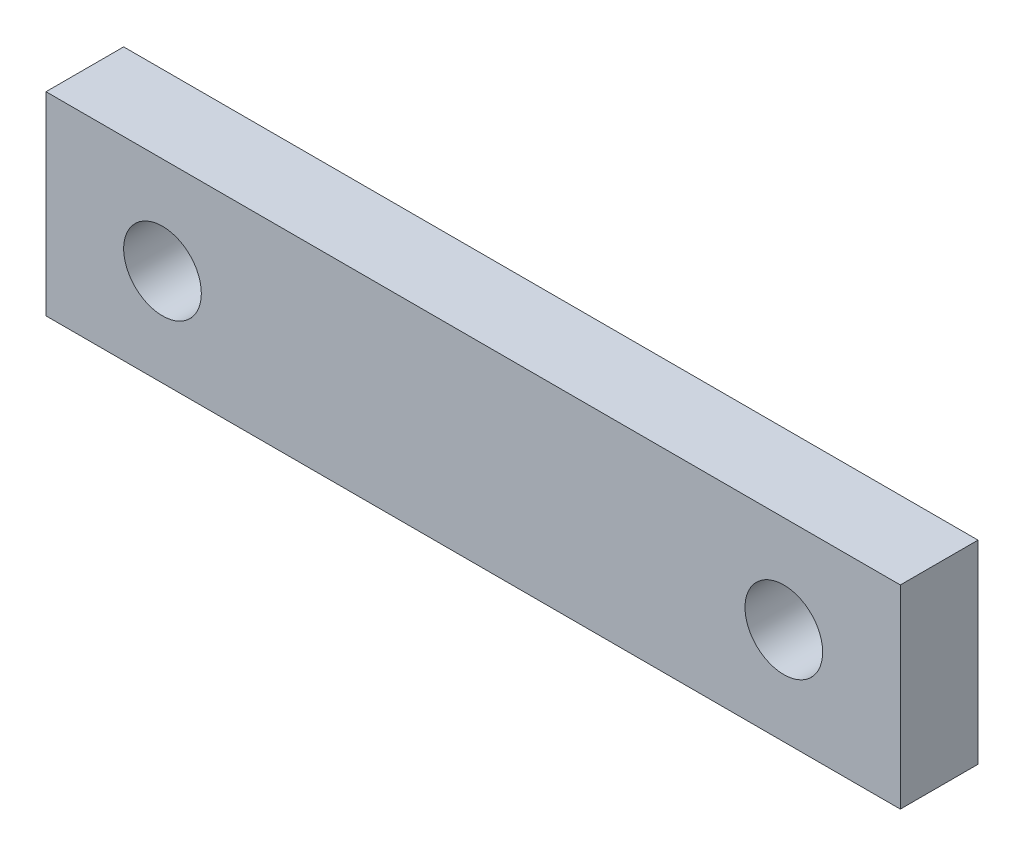
ISO-10303-21;
HEADER;
FILE_DESCRIPTION(('STEP AP214'),'2;1');
FILE_NAME('part.step','',(''),(''),'','','');
FILE_SCHEMA(('AUTOMOTIVE_DESIGN { 1 0 10303 214 1 1 1 1 }'));
ENDSEC;
DATA;
#1=APPLICATION_CONTEXT('core data for automotive mechanical design processes');
#2=APPLICATION_PROTOCOL_DEFINITION('international standard','automotive_design',2000,#1);
#3=PRODUCT_CONTEXT('',#1,'mechanical');
#4=PRODUCT('Part','Part','',(#3));
#5=PRODUCT_RELATED_PRODUCT_CATEGORY('part','',(#4));
#6=PRODUCT_DEFINITION_FORMATION('','',#4);
#7=PRODUCT_DEFINITION_CONTEXT('part definition',#1,'design');
#8=PRODUCT_DEFINITION('design','',#6,#7);
#9=PRODUCT_DEFINITION_SHAPE('','',#8);
#10=(LENGTH_UNIT() NAMED_UNIT(*) SI_UNIT(.MILLI.,.METRE.));
#11=(NAMED_UNIT(*) PLANE_ANGLE_UNIT() SI_UNIT($,.RADIAN.));
#12=(NAMED_UNIT(*) SI_UNIT($,.STERADIAN.) SOLID_ANGLE_UNIT());
#13=UNCERTAINTY_MEASURE_WITH_UNIT(LENGTH_MEASURE(1.E-05),#10,'distance_accuracy_value','');
#14=(GEOMETRIC_REPRESENTATION_CONTEXT(3) GLOBAL_UNCERTAINTY_ASSIGNED_CONTEXT((#13)) GLOBAL_UNIT_ASSIGNED_CONTEXT((#10,
#11,#12)) REPRESENTATION_CONTEXT('',''));
#15=CARTESIAN_POINT('',(0.,0.,0.));
#16=DIRECTION('',(0.,0.,1.));
#17=DIRECTION('',(1.,0.,0.));
#18=AXIS2_PLACEMENT_3D('',#15,#16,#17);
#19=CARTESIAN_POINT('',(-62.9567965181082,47.7044346254966,25.4));
#20=DIRECTION('',(1.,0.,0.));
#21=DIRECTION('',(0.,1.,0.));
#22=AXIS2_PLACEMENT_3D('',#19,#20,#21);
#23=PLANE('',#22);
#24=DIRECTION('',(0.,-1.,0.));
#25=VECTOR('',#24,1.);
#26=CARTESIAN_POINT('',(-62.9567965181082,47.7044346254966,0.));
#27=LINE('',#26,#25);
#28=CARTESIAN_POINT('',(-62.9567965181082,47.7044346254966,0.));
#29=VERTEX_POINT('',#28);
#30=CARTESIAN_POINT('',(-62.9567965181081,-15.7955653745034,0.));
#31=VERTEX_POINT('',#30);
#32=EDGE_CURVE('E107',#29,#31,#27,.T.);
#33=ORIENTED_EDGE('',*,*,#32,.T.);
#34=DIRECTION('',(0.,0.,-1.));
#35=VECTOR('',#34,1.);
#36=CARTESIAN_POINT('',(-62.9567965181081,-15.7955653745034,25.4));
#37=LINE('',#36,#35);
#38=CARTESIAN_POINT('',(-62.9567965181081,-15.7955653745034,25.4));
#39=VERTEX_POINT('',#38);
#40=EDGE_CURVE('E11',#39,#31,#37,.T.);
#41=ORIENTED_EDGE('',*,*,#40,.F.);
#42=DIRECTION('',(0.,-1.,0.));
#43=VECTOR('',#42,1.);
#44=CARTESIAN_POINT('',(-62.9567965181082,47.7044346254966,25.4));
#45=LINE('',#44,#43);
#46=CARTESIAN_POINT('',(-62.9567965181082,47.7044346254966,25.4));
#47=VERTEX_POINT('',#46);
#48=EDGE_CURVE('E91',#47,#39,#45,.T.);
#49=ORIENTED_EDGE('',*,*,#48,.F.);
#50=DIRECTION('',(0.,0.,-1.));
#51=VECTOR('',#50,1.);
#52=CARTESIAN_POINT('',(-62.9567965181082,47.7044346254966,25.4));
#53=LINE('',#52,#51);
#54=EDGE_CURVE('E103',#47,#29,#53,.T.);
#55=ORIENTED_EDGE('',*,*,#54,.T.);
#56=EDGE_LOOP('',(#33,#41,#49,#55));
#57=FACE_BOUND('',#56,.T.);
#58=ADVANCED_FACE('F39',(#57),#23,.F.);
#59=CARTESIAN_POINT('',(-62.9567965181081,-15.7955653745034,25.4));
#60=DIRECTION('',(0.,1.,0.));
#61=DIRECTION('',(0.,0.,1.));
#62=AXIS2_PLACEMENT_3D('',#59,#60,#61);
#63=PLANE('',#62);
#64=DIRECTION('',(1.,0.,0.));
#65=VECTOR('',#64,1.);
#66=CARTESIAN_POINT('',(-62.9567965181081,-15.7955653745034,0.));
#67=LINE('',#66,#65);
#68=CARTESIAN_POINT('',(216.443203481892,-15.7955653745034,0.));
#69=VERTEX_POINT('',#68);
#70=EDGE_CURVE('E96',#31,#69,#67,.T.);
#71=ORIENTED_EDGE('',*,*,#70,.T.);
#72=DIRECTION('',(0.,0.,-1.));
#73=VECTOR('',#72,1.);
#74=CARTESIAN_POINT('',(216.443203481892,-15.7955653745034,25.4));
#75=LINE('',#74,#73);
#76=CARTESIAN_POINT('',(216.443203481892,-15.7955653745034,25.4));
#77=VERTEX_POINT('',#76);
#78=EDGE_CURVE('E48',#77,#69,#75,.T.);
#79=ORIENTED_EDGE('',*,*,#78,.F.);
#80=DIRECTION('',(1.,0.,0.));
#81=VECTOR('',#80,1.);
#82=CARTESIAN_POINT('',(-62.9567965181081,-15.7955653745034,25.4));
#83=LINE('',#82,#81);
#84=EDGE_CURVE('E86',#39,#77,#83,.T.);
#85=ORIENTED_EDGE('',*,*,#84,.F.);
#86=ORIENTED_EDGE('',*,*,#40,.T.);
#87=EDGE_LOOP('',(#71,#79,#85,#86));
#88=FACE_BOUND('',#87,.T.);
#89=ADVANCED_FACE('F95',(#88),#63,.F.);
#90=CARTESIAN_POINT('',(216.443203481892,47.7044346254966,25.4));
#91=DIRECTION('',(-1.,0.,0.));
#92=DIRECTION('',(0.,0.,1.));
#93=AXIS2_PLACEMENT_3D('',#90,#91,#92);
#94=PLANE('',#93);
#95=DIRECTION('',(0.,1.,0.));
#96=VECTOR('',#95,1.);
#97=CARTESIAN_POINT('',(216.443203481892,47.7044346254966,0.));
#98=LINE('',#97,#96);
#99=CARTESIAN_POINT('',(216.443203481892,47.7044346254966,0.));
#100=VERTEX_POINT('',#99);
#101=EDGE_CURVE('E73',#69,#100,#98,.T.);
#102=ORIENTED_EDGE('',*,*,#101,.T.);
#103=DIRECTION('',(0.,0.,-1.));
#104=VECTOR('',#103,1.);
#105=CARTESIAN_POINT('',(216.443203481892,47.7044346254966,25.4));
#106=LINE('',#105,#104);
#107=CARTESIAN_POINT('',(216.443203481892,47.7044346254966,25.4));
#108=VERTEX_POINT('',#107);
#109=EDGE_CURVE('E98',#108,#100,#106,.T.);
#110=ORIENTED_EDGE('',*,*,#109,.F.);
#111=DIRECTION('',(0.,1.,0.));
#112=VECTOR('',#111,1.);
#113=CARTESIAN_POINT('',(216.443203481892,47.7044346254966,25.4));
#114=LINE('',#113,#112);
#115=EDGE_CURVE('E89',#77,#108,#114,.T.);
#116=ORIENTED_EDGE('',*,*,#115,.F.);
#117=ORIENTED_EDGE('',*,*,#78,.T.);
#118=EDGE_LOOP('',(#102,#110,#116,#117));
#119=FACE_BOUND('',#118,.T.);
#120=ADVANCED_FACE('F99',(#119),#94,.F.);
#121=CARTESIAN_POINT('',(-62.9567965181082,47.7044346254966,25.4));
#122=DIRECTION('',(0.,-1.,0.));
#123=DIRECTION('',(0.,0.,-1.));
#124=AXIS2_PLACEMENT_3D('',#121,#122,#123);
#125=PLANE('',#124);
#126=DIRECTION('',(-1.,0.,0.));
#127=VECTOR('',#126,1.);
#128=CARTESIAN_POINT('',(-62.9567965181082,47.7044346254966,0.));
#129=LINE('',#128,#127);
#130=EDGE_CURVE('E79',#100,#29,#129,.T.);
#131=ORIENTED_EDGE('',*,*,#130,.T.);
#132=ORIENTED_EDGE('',*,*,#54,.F.);
#133=DIRECTION('',(-1.,0.,0.));
#134=VECTOR('',#133,1.);
#135=CARTESIAN_POINT('',(-62.9567965181082,47.7044346254966,25.4));
#136=LINE('',#135,#134);
#137=EDGE_CURVE('E56',#108,#47,#136,.T.);
#138=ORIENTED_EDGE('',*,*,#137,.F.);
#139=ORIENTED_EDGE('',*,*,#109,.T.);
#140=EDGE_LOOP('',(#131,#132,#138,#139));
#141=FACE_BOUND('',#140,.T.);
#142=ADVANCED_FACE('F121',(#141),#125,.F.);
#143=CARTESIAN_POINT('',(0.,0.,25.4));
#144=DIRECTION('',(0.,0.,1.));
#145=DIRECTION('',(1.,0.,0.));
#146=AXIS2_PLACEMENT_3D('',#143,#144,#145);
#147=PLANE('',#146);
#148=CARTESIAN_POINT('',(-24.8567965181082,15.9544346254966,25.4));
#149=DIRECTION('',(0.,0.,1.));
#150=DIRECTION('',(1.,0.,0.));
#151=AXIS2_PLACEMENT_3D('',#148,#149,#150);
#152=CIRCLE('',#151,12.7);
#153=CARTESIAN_POINT('',(-12.1567965181082,15.9544346254966,25.4));
#154=VERTEX_POINT('',#153);
#155=EDGE_CURVE('E136',#154,#154,#152,.T.);
#156=ORIENTED_EDGE('',*,*,#155,.F.);
#157=EDGE_LOOP('',(#156));
#158=FACE_BOUND('',#157,.T.);
#159=CARTESIAN_POINT('',(178.343203481892,15.9544346254966,25.4));
#160=DIRECTION('',(0.,0.,1.));
#161=DIRECTION('',(1.,0.,0.));
#162=AXIS2_PLACEMENT_3D('',#159,#160,#161);
#163=CIRCLE('',#162,12.7);
#164=CARTESIAN_POINT('',(191.043203481892,15.9544346254966,25.4));
#165=VERTEX_POINT('',#164);
#166=EDGE_CURVE('E128',#165,#165,#163,.T.);
#167=ORIENTED_EDGE('',*,*,#166,.F.);
#168=EDGE_LOOP('',(#167));
#169=FACE_BOUND('',#168,.T.);
#170=ORIENTED_EDGE('',*,*,#48,.T.);
#171=ORIENTED_EDGE('',*,*,#84,.T.);
#172=ORIENTED_EDGE('',*,*,#115,.T.);
#173=ORIENTED_EDGE('',*,*,#137,.T.);
#174=EDGE_LOOP('',(#170,#171,#172,#173));
#175=FACE_BOUND('',#174,.T.);
#176=ADVANCED_FACE('F87',(#158,#169,#175),#147,.T.);
#177=CARTESIAN_POINT('',(0.,0.,0.));
#178=DIRECTION('',(0.,0.,1.));
#179=DIRECTION('',(1.,0.,0.));
#180=AXIS2_PLACEMENT_3D('',#177,#178,#179);
#181=PLANE('',#180);
#182=CARTESIAN_POINT('',(-24.8567965181082,15.9544346254966,0.));
#183=DIRECTION('',(0.,0.,1.));
#184=DIRECTION('',(1.,0.,0.));
#185=AXIS2_PLACEMENT_3D('',#182,#183,#184);
#186=CIRCLE('',#185,12.7);
#187=CARTESIAN_POINT('',(-12.1567965181082,15.9544346254966,0.));
#188=VERTEX_POINT('',#187);
#189=EDGE_CURVE('E132',#188,#188,#186,.T.);
#190=ORIENTED_EDGE('',*,*,#189,.T.);
#191=EDGE_LOOP('',(#190));
#192=FACE_BOUND('',#191,.T.);
#193=CARTESIAN_POINT('',(178.343203481892,15.9544346254966,0.));
#194=DIRECTION('',(0.,0.,1.));
#195=DIRECTION('',(1.,0.,0.));
#196=AXIS2_PLACEMENT_3D('',#193,#194,#195);
#197=CIRCLE('',#196,12.7);
#198=CARTESIAN_POINT('',(191.043203481892,15.9544346254966,0.));
#199=VERTEX_POINT('',#198);
#200=EDGE_CURVE('E111',#199,#199,#197,.T.);
#201=ORIENTED_EDGE('',*,*,#200,.T.);
#202=EDGE_LOOP('',(#201));
#203=FACE_BOUND('',#202,.T.);
#204=ORIENTED_EDGE('',*,*,#32,.F.);
#205=ORIENTED_EDGE('',*,*,#130,.F.);
#206=ORIENTED_EDGE('',*,*,#101,.F.);
#207=ORIENTED_EDGE('',*,*,#70,.F.);
#208=EDGE_LOOP('',(#204,#205,#206,#207));
#209=FACE_BOUND('',#208,.T.);
#210=ADVANCED_FACE('F124',(#192,#203,#209),#181,.F.);
#211=CARTESIAN_POINT('',(178.343203481892,15.9544346254966,0.));
#212=DIRECTION('',(0.,0.,1.));
#213=DIRECTION('',(1.,0.,0.));
#214=AXIS2_PLACEMENT_3D('',#211,#212,#213);
#215=CYLINDRICAL_SURFACE('',#214,12.7);
#216=ORIENTED_EDGE('',*,*,#200,.F.);
#217=EDGE_LOOP('',(#216));
#218=FACE_BOUND('',#217,.T.);
#219=ORIENTED_EDGE('',*,*,#166,.T.);
#220=EDGE_LOOP('',(#219));
#221=FACE_BOUND('',#220,.T.);
#222=ADVANCED_FACE('F149',(#218,#221),#215,.F.);
#223=CARTESIAN_POINT('',(-24.8567965181082,15.9544346254966,0.));
#224=DIRECTION('',(0.,0.,1.));
#225=DIRECTION('',(1.,0.,0.));
#226=AXIS2_PLACEMENT_3D('',#223,#224,#225);
#227=CYLINDRICAL_SURFACE('',#226,12.7);
#228=ORIENTED_EDGE('',*,*,#189,.F.);
#229=EDGE_LOOP('',(#228));
#230=FACE_BOUND('',#229,.T.);
#231=ORIENTED_EDGE('',*,*,#155,.T.);
#232=EDGE_LOOP('',(#231));
#233=FACE_BOUND('',#232,.T.);
#234=ADVANCED_FACE('F146',(#230,#233),#227,.F.);
#235=CLOSED_SHELL('',(#58,#89,#120,#142,#176,#210,#222,#234));
#236=MANIFOLD_SOLID_BREP('B2',#235);
#237=ADVANCED_BREP_SHAPE_REPRESENTATION('',(#18,#236),#14);
#238=SHAPE_DEFINITION_REPRESENTATION(#9,#237);
ENDSEC;
END-ISO-10303-21;
